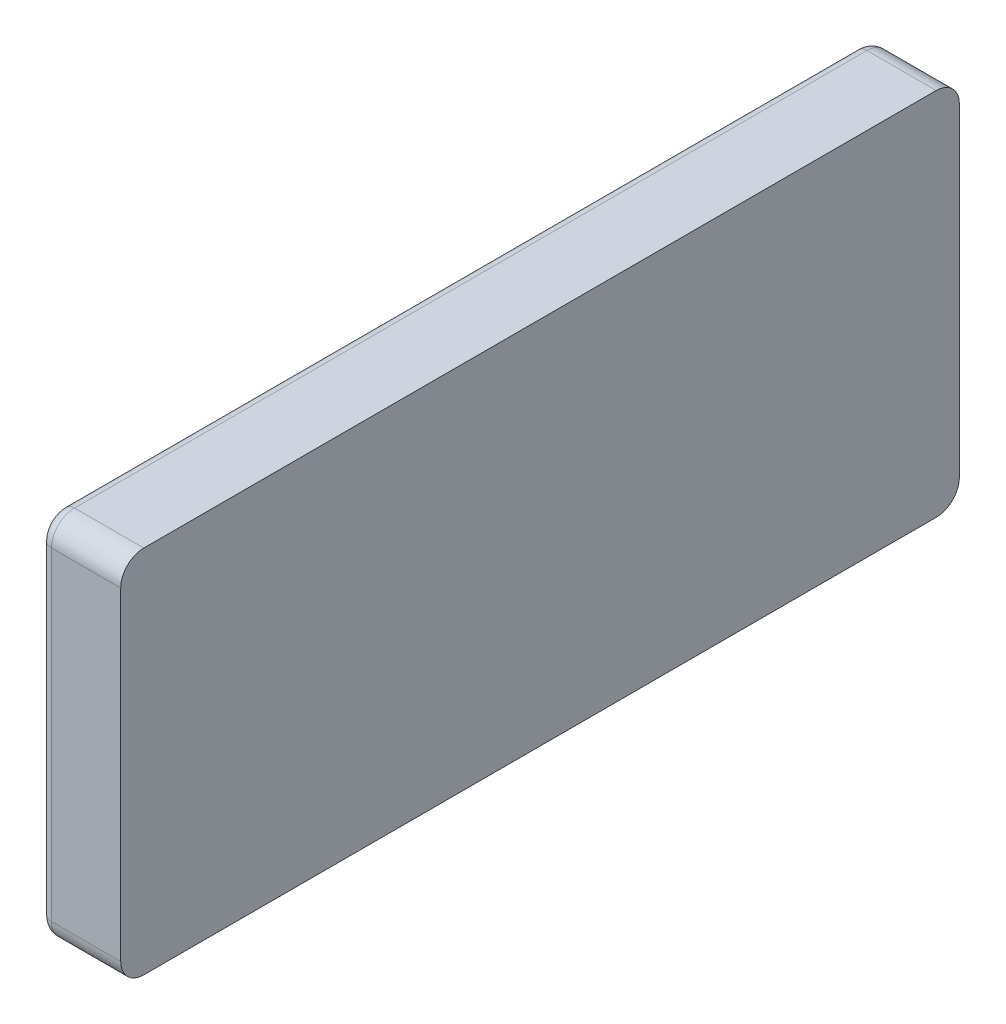
ISO-10303-21;
HEADER;
FILE_DESCRIPTION(('STEP AP214'),'2;1');
FILE_NAME('part.step','',(''),(''),'','','');
FILE_SCHEMA(('AUTOMOTIVE_DESIGN { 1 0 10303 214 1 1 1 1 }'));
ENDSEC;
DATA;
#1=APPLICATION_CONTEXT('core data for automotive mechanical design processes');
#2=APPLICATION_PROTOCOL_DEFINITION('international standard','automotive_design',2000,#1);
#3=PRODUCT_CONTEXT('',#1,'mechanical');
#4=PRODUCT('Part','Part','',(#3));
#5=PRODUCT_RELATED_PRODUCT_CATEGORY('part','',(#4));
#6=PRODUCT_DEFINITION_FORMATION('','',#4);
#7=PRODUCT_DEFINITION_CONTEXT('part definition',#1,'design');
#8=PRODUCT_DEFINITION('design','',#6,#7);
#9=PRODUCT_DEFINITION_SHAPE('','',#8);
#10=(LENGTH_UNIT() NAMED_UNIT(*) SI_UNIT(.MILLI.,.METRE.));
#11=(NAMED_UNIT(*) PLANE_ANGLE_UNIT() SI_UNIT($,.RADIAN.));
#12=(NAMED_UNIT(*) SI_UNIT($,.STERADIAN.) SOLID_ANGLE_UNIT());
#13=UNCERTAINTY_MEASURE_WITH_UNIT(LENGTH_MEASURE(1.E-05),#10,'distance_accuracy_value','');
#14=(GEOMETRIC_REPRESENTATION_CONTEXT(3) GLOBAL_UNCERTAINTY_ASSIGNED_CONTEXT((#13)) GLOBAL_UNIT_ASSIGNED_CONTEXT((#10,
#11,#12)) REPRESENTATION_CONTEXT('',''));
#15=CARTESIAN_POINT('',(0.,0.,0.));
#16=DIRECTION('',(0.,0.,1.));
#17=DIRECTION('',(1.,0.,0.));
#18=AXIS2_PLACEMENT_3D('',#15,#16,#17);
#19=CARTESIAN_POINT('',(-24.0876040847697,19.4723765469581,42.1421599693255));
#20=DIRECTION('',(-1.,0.,0.));
#21=DIRECTION('',(0.,0.707106781186549,-0.707106781186546));
#22=AXIS2_PLACEMENT_3D('',#19,#20,#21);
#23=CYLINDRICAL_SURFACE('',#22,1.);
#24=CARTESIAN_POINT('',(-51.2876040847697,19.472376546958,42.1421599693246));
#25=DIRECTION('',(-1.,0.,0.));
#26=DIRECTION('',(0.,0.707106781186549,-0.707106781186546));
#27=AXIS2_PLACEMENT_3D('',#24,#25,#26);
#28=CIRCLE('',#27,1.);
#29=CARTESIAN_POINT('',(-51.2876040847697,20.4723765469581,42.1421599693246));
#30=VERTEX_POINT('',#29);
#31=CARTESIAN_POINT('',(-51.2876040847697,19.472376546958,41.1421599693246));
#32=VERTEX_POINT('',#31);
#33=EDGE_CURVE('E234',#30,#32,#28,.T.);
#34=ORIENTED_EDGE('',*,*,#33,.T.);
#35=DIRECTION('',(-1.,0.,0.));
#36=VECTOR('',#35,1.);
#37=CARTESIAN_POINT('',(-24.0876040847697,19.4723765469581,41.1421599693255));
#38=LINE('',#37,#36);
#39=CARTESIAN_POINT('',(-54.2876040847697,19.472376546958,41.1421599693245));
#40=VERTEX_POINT('',#39);
#41=EDGE_CURVE('E225',#32,#40,#38,.T.);
#42=ORIENTED_EDGE('',*,*,#41,.T.);
#43=CARTESIAN_POINT('',(-54.2876040847697,19.472376546958,42.1421599693245));
#44=DIRECTION('',(-1.,0.,0.));
#45=DIRECTION('',(0.,0.707106781186549,-0.707106781186546));
#46=AXIS2_PLACEMENT_3D('',#43,#44,#45);
#47=CIRCLE('',#46,1.);
#48=CARTESIAN_POINT('',(-54.2876040847697,20.472376546958,42.1421599693245));
#49=VERTEX_POINT('',#48);
#50=EDGE_CURVE('E272',#49,#40,#47,.T.);
#51=ORIENTED_EDGE('',*,*,#50,.F.);
#52=DIRECTION('',(1.,0.,0.));
#53=VECTOR('',#52,1.);
#54=CARTESIAN_POINT('',(-24.0876040847697,20.4723765469581,42.1421599693255));
#55=LINE('',#54,#53);
#56=EDGE_CURVE('E317',#49,#30,#55,.T.);
#57=ORIENTED_EDGE('',*,*,#56,.T.);
#58=EDGE_LOOP('',(#34,#42,#51,#57));
#59=FACE_BOUND('',#58,.T.);
#60=ADVANCED_FACE('F17',(#59),#23,.T.);
#61=CARTESIAN_POINT('',(-54.7876040847707,17.972376546958,74.9421599693245));
#62=DIRECTION('',(1.,0.,0.));
#63=DIRECTION('',(0.,-1.,0.));
#64=AXIS2_PLACEMENT_3D('',#61,#62,#63);
#65=CYLINDRICAL_SURFACE('',#64,1.5);
#66=CARTESIAN_POINT('',(-54.7876040847707,17.972376546958,74.9421599693245));
#67=DIRECTION('',(1.,0.,0.));
#68=DIRECTION('',(0.,-1.,0.));
#69=AXIS2_PLACEMENT_3D('',#66,#67,#68);
#70=CIRCLE('',#69,1.5);
#71=CARTESIAN_POINT('',(-54.7876040847707,19.472376546958,74.9421599693245));
#72=VERTEX_POINT('',#71);
#73=EDGE_CURVE('E321',#72,#72,#70,.T.);
#74=ORIENTED_EDGE('',*,*,#73,.F.);
#75=DIRECTION('',(1.,0.,0.));
#76=VECTOR('',#75,1.);
#77=CARTESIAN_POINT('',(-54.7876040847707,19.472376546958,74.9421599693245));
#78=LINE('',#77,#76);
#79=CARTESIAN_POINT('',(-52.7876040847707,19.472376546958,74.9421599693246));
#80=VERTEX_POINT('',#79);
#81=EDGE_CURVE('E11',#72,#80,#78,.T.);
#82=ORIENTED_EDGE('',*,*,#81,.T.);
#83=CARTESIAN_POINT('',(-52.7876040847707,17.972376546958,74.9421599693246));
#84=DIRECTION('',(1.,0.,0.));
#85=DIRECTION('',(0.,-1.,0.));
#86=AXIS2_PLACEMENT_3D('',#83,#84,#85);
#87=CIRCLE('',#86,1.5);
#88=EDGE_CURVE('E27',#80,#80,#87,.T.);
#89=ORIENTED_EDGE('',*,*,#88,.T.);
#90=ORIENTED_EDGE('',*,*,#81,.F.);
#91=EDGE_LOOP('',(#74,#82,#89,#90));
#92=FACE_BOUND('',#91,.T.);
#93=ADVANCED_FACE('F540',(#92),#65,.F.);
#94=CARTESIAN_POINT('',(-52.7876040847707,17.972376546958,74.9421599693246));
#95=DIRECTION('',(-1.,0.,0.));
#96=DIRECTION('',(0.,0.,1.));
#97=AXIS2_PLACEMENT_3D('',#94,#95,#96);
#98=PLANE('',#97);
#99=ORIENTED_EDGE('',*,*,#88,.F.);
#100=EDGE_LOOP('',(#99));
#101=FACE_BOUND('',#100,.T.);
#102=ADVANCED_FACE('F544',(#101),#98,.T.);
#103=CARTESIAN_POINT('',(-54.7876040847707,6.97237654695804,74.9421599693245));
#104=DIRECTION('',(1.,0.,0.));
#105=DIRECTION('',(0.,-1.,0.));
#106=AXIS2_PLACEMENT_3D('',#103,#104,#105);
#107=CYLINDRICAL_SURFACE('',#106,1.5);
#108=CARTESIAN_POINT('',(-54.7876040847707,6.97237654695804,74.9421599693245));
#109=DIRECTION('',(1.,0.,0.));
#110=DIRECTION('',(0.,-1.,0.));
#111=AXIS2_PLACEMENT_3D('',#108,#109,#110);
#112=CIRCLE('',#111,1.5);
#113=CARTESIAN_POINT('',(-54.7876040847707,8.47237654695804,74.9421599693245));
#114=VERTEX_POINT('',#113);
#115=EDGE_CURVE('E310',#114,#114,#112,.T.);
#116=ORIENTED_EDGE('',*,*,#115,.F.);
#117=DIRECTION('',(1.,0.,0.));
#118=VECTOR('',#117,1.);
#119=CARTESIAN_POINT('',(-54.7876040847707,8.47237654695804,74.9421599693245));
#120=LINE('',#119,#118);
#121=CARTESIAN_POINT('',(-52.7876040847707,8.47237654695805,74.9421599693246));
#122=VERTEX_POINT('',#121);
#123=EDGE_CURVE('E21',#114,#122,#120,.T.);
#124=ORIENTED_EDGE('',*,*,#123,.T.);
#125=CARTESIAN_POINT('',(-52.7876040847707,6.97237654695805,74.9421599693246));
#126=DIRECTION('',(1.,0.,0.));
#127=DIRECTION('',(0.,-1.,0.));
#128=AXIS2_PLACEMENT_3D('',#125,#126,#127);
#129=CIRCLE('',#128,1.5);
#130=EDGE_CURVE('E322',#122,#122,#129,.T.);
#131=ORIENTED_EDGE('',*,*,#130,.T.);
#132=ORIENTED_EDGE('',*,*,#123,.F.);
#133=EDGE_LOOP('',(#116,#124,#131,#132));
#134=FACE_BOUND('',#133,.T.);
#135=ADVANCED_FACE('F668',(#134),#107,.F.);
#136=CARTESIAN_POINT('',(-52.7876040847707,6.97237654695805,74.9421599693246));
#137=DIRECTION('',(-1.,0.,0.));
#138=DIRECTION('',(0.,0.,1.));
#139=AXIS2_PLACEMENT_3D('',#136,#137,#138);
#140=PLANE('',#139);
#141=ORIENTED_EDGE('',*,*,#130,.F.);
#142=EDGE_LOOP('',(#141));
#143=FACE_BOUND('',#142,.T.);
#144=ADVANCED_FACE('F620',(#143),#140,.T.);
#145=CARTESIAN_POINT('',(-54.7876040847697,17.972376546958,43.6421599693245));
#146=DIRECTION('',(1.,0.,0.));
#147=DIRECTION('',(0.,-1.,0.));
#148=AXIS2_PLACEMENT_3D('',#145,#146,#147);
#149=CYLINDRICAL_SURFACE('',#148,1.5);
#150=CARTESIAN_POINT('',(-54.7876040847698,17.972376546958,43.6421599693245));
#151=DIRECTION('',(1.,0.,0.));
#152=DIRECTION('',(0.,-1.,0.));
#153=AXIS2_PLACEMENT_3D('',#150,#151,#152);
#154=CIRCLE('',#153,1.5);
#155=CARTESIAN_POINT('',(-54.7876040847698,19.472376546958,43.6421599693245));
#156=VERTEX_POINT('',#155);
#157=EDGE_CURVE('E305',#156,#156,#154,.T.);
#158=ORIENTED_EDGE('',*,*,#157,.F.);
#159=DIRECTION('',(1.,0.,0.));
#160=VECTOR('',#159,1.);
#161=CARTESIAN_POINT('',(-54.7876040847697,19.472376546958,43.6421599693245));
#162=LINE('',#161,#160);
#163=CARTESIAN_POINT('',(-52.7876040847698,19.472376546958,43.6421599693246));
#164=VERTEX_POINT('',#163);
#165=EDGE_CURVE('E325',#156,#164,#162,.T.);
#166=ORIENTED_EDGE('',*,*,#165,.T.);
#167=CARTESIAN_POINT('',(-52.7876040847697,17.972376546958,43.6421599693246));
#168=DIRECTION('',(1.,0.,0.));
#169=DIRECTION('',(0.,-1.,0.));
#170=AXIS2_PLACEMENT_3D('',#167,#168,#169);
#171=CIRCLE('',#170,1.5);
#172=EDGE_CURVE('E212',#164,#164,#171,.T.);
#173=ORIENTED_EDGE('',*,*,#172,.T.);
#174=ORIENTED_EDGE('',*,*,#165,.F.);
#175=EDGE_LOOP('',(#158,#166,#173,#174));
#176=FACE_BOUND('',#175,.T.);
#177=ADVANCED_FACE('F366',(#176),#149,.F.);
#178=CARTESIAN_POINT('',(-52.7876040847697,17.972376546958,43.6421599693246));
#179=DIRECTION('',(-1.,0.,0.));
#180=DIRECTION('',(0.,0.,1.));
#181=AXIS2_PLACEMENT_3D('',#178,#179,#180);
#182=PLANE('',#181);
#183=ORIENTED_EDGE('',*,*,#172,.F.);
#184=EDGE_LOOP('',(#183));
#185=FACE_BOUND('',#184,.T.);
#186=ADVANCED_FACE('F619',(#185),#182,.T.);
#187=CARTESIAN_POINT('',(-54.7876040847697,6.97237654695804,43.6421599693245));
#188=DIRECTION('',(1.,0.,0.));
#189=DIRECTION('',(0.,-1.,0.));
#190=AXIS2_PLACEMENT_3D('',#187,#188,#189);
#191=CYLINDRICAL_SURFACE('',#190,1.5);
#192=CARTESIAN_POINT('',(-54.7876040847697,6.97237654695804,43.6421599693245));
#193=DIRECTION('',(1.,0.,0.));
#194=DIRECTION('',(0.,-1.,0.));
#195=AXIS2_PLACEMENT_3D('',#192,#193,#194);
#196=CIRCLE('',#195,1.5);
#197=CARTESIAN_POINT('',(-54.7876040847697,8.47237654695804,43.6421599693245));
#198=VERTEX_POINT('',#197);
#199=EDGE_CURVE('E309',#198,#198,#196,.T.);
#200=ORIENTED_EDGE('',*,*,#199,.F.);
#201=DIRECTION('',(1.,0.,0.));
#202=VECTOR('',#201,1.);
#203=CARTESIAN_POINT('',(-54.7876040847697,8.47237654695804,43.6421599693245));
#204=LINE('',#203,#202);
#205=CARTESIAN_POINT('',(-52.7876040847697,8.47237654695805,43.6421599693246));
#206=VERTEX_POINT('',#205);
#207=EDGE_CURVE('E210',#198,#206,#204,.T.);
#208=ORIENTED_EDGE('',*,*,#207,.T.);
#209=CARTESIAN_POINT('',(-52.7876040847697,6.97237654695805,43.6421599693246));
#210=DIRECTION('',(1.,0.,0.));
#211=DIRECTION('',(0.,-1.,0.));
#212=AXIS2_PLACEMENT_3D('',#209,#210,#211);
#213=CIRCLE('',#212,1.5);
#214=EDGE_CURVE('E213',#206,#206,#213,.T.);
#215=ORIENTED_EDGE('',*,*,#214,.T.);
#216=ORIENTED_EDGE('',*,*,#207,.F.);
#217=EDGE_LOOP('',(#200,#208,#215,#216));
#218=FACE_BOUND('',#217,.T.);
#219=ADVANCED_FACE('F643',(#218),#191,.F.);
#220=CARTESIAN_POINT('',(-52.7876040847697,6.97237654695805,43.6421599693246));
#221=DIRECTION('',(-1.,0.,0.));
#222=DIRECTION('',(0.,0.,1.));
#223=AXIS2_PLACEMENT_3D('',#220,#221,#222);
#224=PLANE('',#223);
#225=ORIENTED_EDGE('',*,*,#214,.F.);
#226=EDGE_LOOP('',(#225));
#227=FACE_BOUND('',#226,.T.);
#228=ADVANCED_FACE('F635',(#227),#224,.T.);
#229=CARTESIAN_POINT('',(-24.0876040847708,20.4723765469581,77.4421599693255));
#230=DIRECTION('',(0.,1.,0.));
#231=DIRECTION('',(1.,0.,0.));
#232=AXIS2_PLACEMENT_3D('',#229,#230,#231);
#233=PLANE('',#232);
#234=DIRECTION('',(0.,0.,-1.));
#235=VECTOR('',#234,1.);
#236=CARTESIAN_POINT('',(-51.2876040847705,20.4723765469581,68.3671599693248));
#237=LINE('',#236,#235);
#238=CARTESIAN_POINT('',(-51.2876040847708,20.4723765469581,76.4421599693246));
#239=VERTEX_POINT('',#238);
#240=EDGE_CURVE('E238',#239,#30,#237,.T.);
#241=ORIENTED_EDGE('',*,*,#240,.T.);
#242=ORIENTED_EDGE('',*,*,#56,.F.);
#243=DIRECTION('',(0.,0.,-1.));
#244=VECTOR('',#243,1.);
#245=CARTESIAN_POINT('',(-54.2876040847705,20.472376546958,68.3671599693245));
#246=LINE('',#245,#244);
#247=CARTESIAN_POINT('',(-54.2876040847708,20.472376546958,76.4421599693245));
#248=VERTEX_POINT('',#247);
#249=EDGE_CURVE('E273',#248,#49,#246,.T.);
#250=ORIENTED_EDGE('',*,*,#249,.F.);
#251=DIRECTION('',(-1.,0.,0.));
#252=VECTOR('',#251,1.);
#253=CARTESIAN_POINT('',(-24.0876040847708,20.4723765469581,76.4421599693255));
#254=LINE('',#253,#252);
#255=EDGE_CURVE('E276',#239,#248,#254,.T.);
#256=ORIENTED_EDGE('',*,*,#255,.F.);
#257=EDGE_LOOP('',(#241,#242,#250,#256));
#258=FACE_BOUND('',#257,.T.);
#259=ADVANCED_FACE('F408',(#258),#233,.T.);
#260=CARTESIAN_POINT('',(-54.2876040847697,19.472376546958,42.1421599693245));
#261=DIRECTION('',(1.,0.,0.));
#262=DIRECTION('',(0.,0.,-1.));
#263=AXIS2_PLACEMENT_3D('',#260,#261,#262);
#264=DEGENERATE_TOROIDAL_SURFACE('',#263,0.5,0.500000000000013,.T.);
#265=CARTESIAN_POINT('',(-54.2876040847697,19.472376546958,41.6421599693245));
#266=DIRECTION('',(0.,1.,0.));
#267=DIRECTION('',(0.,0.,-1.));
#268=AXIS2_PLACEMENT_3D('',#265,#266,#267);
#269=CIRCLE('',#268,0.5);
#270=CARTESIAN_POINT('',(-54.7876040847697,19.472376546958,41.6421599693245));
#271=VERTEX_POINT('',#270);
#272=EDGE_CURVE('E229',#40,#271,#269,.T.);
#273=ORIENTED_EDGE('',*,*,#272,.T.);
#274=CARTESIAN_POINT('',(-54.7876040847697,19.472376546958,42.1421599693245));
#275=DIRECTION('',(1.,0.,0.));
#276=DIRECTION('',(0.,0.707106781186549,-0.707106781186546));
#277=AXIS2_PLACEMENT_3D('',#274,#275,#276);
#278=CIRCLE('',#277,0.5);
#279=CARTESIAN_POINT('',(-54.7876040847697,19.972376546958,42.1421599693245));
#280=VERTEX_POINT('',#279);
#281=EDGE_CURVE('E284',#271,#280,#278,.T.);
#282=ORIENTED_EDGE('',*,*,#281,.T.);
#283=CARTESIAN_POINT('',(-54.2876040847697,19.972376546958,42.1421599693245));
#284=DIRECTION('',(0.,0.,-1.));
#285=DIRECTION('',(-1.,0.,0.));
#286=AXIS2_PLACEMENT_3D('',#283,#284,#285);
#287=CIRCLE('',#286,0.500000000000007);
#288=EDGE_CURVE('E269',#280,#49,#287,.T.);
#289=ORIENTED_EDGE('',*,*,#288,.T.);
#290=ORIENTED_EDGE('',*,*,#50,.T.);
#291=EDGE_LOOP('',(#273,#282,#289,#290));
#292=FACE_BOUND('',#291,.T.);
#293=ADVANCED_FACE('F384',(#292),#264,.T.);
#294=CARTESIAN_POINT('',(-54.2876040847705,19.972376546958,68.3671599693245));
#295=DIRECTION('',(0.,0.,-1.));
#296=DIRECTION('',(-0.707106781186544,0.707106781186551,0.));
#297=AXIS2_PLACEMENT_3D('',#294,#295,#296);
#298=CYLINDRICAL_SURFACE('',#297,0.5);
#299=CARTESIAN_POINT('',(-54.2876040847708,19.972376546958,76.4421599693245));
#300=DIRECTION('',(0.,0.,-1.));
#301=DIRECTION('',(-1.,0.,0.));
#302=AXIS2_PLACEMENT_3D('',#299,#300,#301);
#303=CIRCLE('',#302,0.5);
#304=CARTESIAN_POINT('',(-54.7876040847708,19.972376546958,76.4421599693245));
#305=VERTEX_POINT('',#304);
#306=EDGE_CURVE('E348',#305,#248,#303,.T.);
#307=ORIENTED_EDGE('',*,*,#306,.T.);
#308=ORIENTED_EDGE('',*,*,#249,.T.);
#309=ORIENTED_EDGE('',*,*,#288,.F.);
#310=DIRECTION('',(0.,0.,1.));
#311=VECTOR('',#310,1.);
#312=CARTESIAN_POINT('',(-54.7876040847705,19.972376546958,68.3671599693245));
#313=LINE('',#312,#311);
#314=EDGE_CURVE('E314',#280,#305,#313,.T.);
#315=ORIENTED_EDGE('',*,*,#314,.T.);
#316=EDGE_LOOP('',(#307,#308,#309,#315));
#317=FACE_BOUND('',#316,.T.);
#318=ADVANCED_FACE('F406',(#317),#298,.T.);
#319=CARTESIAN_POINT('',(-54.2876040847708,19.472376546958,76.4421599693245));
#320=DIRECTION('',(1.,0.,0.));
#321=DIRECTION('',(0.,0.,-1.));
#322=AXIS2_PLACEMENT_3D('',#319,#320,#321);
#323=DEGENERATE_TOROIDAL_SURFACE('',#322,0.499999999999966,0.500000000000006,.T.);
#324=CARTESIAN_POINT('',(-54.2876040847708,19.472376546958,76.9421599693245));
#325=DIRECTION('',(0.,1.,0.));
#326=DIRECTION('',(-1.,0.,0.));
#327=AXIS2_PLACEMENT_3D('',#324,#325,#326);
#328=CIRCLE('',#327,0.499999999999989);
#329=CARTESIAN_POINT('',(-54.7876040847708,19.472376546958,76.9421599693245));
#330=VERTEX_POINT('',#329);
#331=CARTESIAN_POINT('',(-54.2876040847708,19.472376546958,77.4421599693245));
#332=VERTEX_POINT('',#331);
#333=EDGE_CURVE('E345',#330,#332,#328,.T.);
#334=ORIENTED_EDGE('',*,*,#333,.T.);
#335=CARTESIAN_POINT('',(-54.2876040847708,19.472376546958,76.4421599693245));
#336=DIRECTION('',(-1.,0.,0.));
#337=DIRECTION('',(0.,0.707106781186551,0.707106781186544));
#338=AXIS2_PLACEMENT_3D('',#335,#336,#337);
#339=CIRCLE('',#338,1.);
#340=EDGE_CURVE('E280',#332,#248,#339,.T.);
#341=ORIENTED_EDGE('',*,*,#340,.T.);
#342=ORIENTED_EDGE('',*,*,#306,.F.);
#343=CARTESIAN_POINT('',(-54.7876040847708,19.472376546958,76.4421599693245));
#344=DIRECTION('',(1.,0.,0.));
#345=DIRECTION('',(0.,0.707106781186551,0.707106781186544));
#346=AXIS2_PLACEMENT_3D('',#343,#344,#345);
#347=CIRCLE('',#346,0.5);
#348=EDGE_CURVE('E302',#305,#330,#347,.T.);
#349=ORIENTED_EDGE('',*,*,#348,.T.);
#350=EDGE_LOOP('',(#334,#341,#342,#349));
#351=FACE_BOUND('',#350,.T.);
#352=ADVANCED_FACE('F403',(#351),#323,.T.);
#353=CARTESIAN_POINT('',(-54.2876040847708,8.47237654695805,76.9421599693245));
#354=DIRECTION('',(0.,1.,0.));
#355=DIRECTION('',(-0.707106781186573,0.,0.707106781186522));
#356=AXIS2_PLACEMENT_3D('',#353,#354,#355);
#357=CYLINDRICAL_SURFACE('',#356,0.5);
#358=CARTESIAN_POINT('',(-54.2876040847708,5.47237654695804,76.9421599693245));
#359=DIRECTION('',(0.,1.,0.));
#360=DIRECTION('',(-1.,0.,0.));
#361=AXIS2_PLACEMENT_3D('',#358,#359,#360);
#362=CIRCLE('',#361,0.5);
#363=CARTESIAN_POINT('',(-54.7876040847708,5.47237654695804,76.9421599693245));
#364=VERTEX_POINT('',#363);
#365=CARTESIAN_POINT('',(-54.2876040847708,5.47237654695804,77.4421599693245));
#366=VERTEX_POINT('',#365);
#367=EDGE_CURVE('E342',#364,#366,#362,.T.);
#368=ORIENTED_EDGE('',*,*,#367,.T.);
#369=DIRECTION('',(0.,1.,0.));
#370=VECTOR('',#369,1.);
#371=CARTESIAN_POINT('',(-54.2876040847708,8.47237654695805,77.4421599693245));
#372=LINE('',#371,#370);
#373=EDGE_CURVE('E176',#366,#332,#372,.T.);
#374=ORIENTED_EDGE('',*,*,#373,.T.);
#375=ORIENTED_EDGE('',*,*,#333,.F.);
#376=DIRECTION('',(0.,-1.,0.));
#377=VECTOR('',#376,1.);
#378=CARTESIAN_POINT('',(-54.7876040847708,8.47237654695804,76.9421599693245));
#379=LINE('',#378,#377);
#380=EDGE_CURVE('E298',#330,#364,#379,.T.);
#381=ORIENTED_EDGE('',*,*,#380,.T.);
#382=EDGE_LOOP('',(#368,#374,#375,#381));
#383=FACE_BOUND('',#382,.T.);
#384=ADVANCED_FACE('F401',(#383),#357,.T.);
#385=CARTESIAN_POINT('',(-54.2876040847707,5.47237654695799,76.4421599693246));
#386=DIRECTION('',(1.,0.,2.22044604925013E-13));
#387=DIRECTION('',(2.22044604925013E-13,0.,-1.));
#388=AXIS2_PLACEMENT_3D('',#385,#386,#387);
#389=DEGENERATE_TOROIDAL_SURFACE('',#388,0.499999999999903,0.499999999999997,.T.);
#390=CARTESIAN_POINT('',(-54.2876040847707,4.97237654695804,76.4421599693245));
#391=DIRECTION('',(0.,0.,1.));
#392=DIRECTION('',(-1.,0.,0.));
#393=AXIS2_PLACEMENT_3D('',#390,#391,#392);
#394=CIRCLE('',#393,0.499999999999989);
#395=CARTESIAN_POINT('',(-54.7876040847707,4.97237654695804,76.4421599693245));
#396=VERTEX_POINT('',#395);
#397=CARTESIAN_POINT('',(-54.2876040847707,4.47237654695804,76.4421599693245));
#398=VERTEX_POINT('',#397);
#399=EDGE_CURVE('E339',#396,#398,#394,.T.);
#400=ORIENTED_EDGE('',*,*,#399,.T.);
#401=CARTESIAN_POINT('',(-54.2876040847707,5.47237654695804,76.4421599693245));
#402=DIRECTION('',(-1.,0.,0.));
#403=DIRECTION('',(0.,-0.70710678118655,0.707106781186545));
#404=AXIS2_PLACEMENT_3D('',#401,#402,#403);
#405=CIRCLE('',#404,1.);
#406=EDGE_CURVE('E181',#398,#366,#405,.T.);
#407=ORIENTED_EDGE('',*,*,#406,.T.);
#408=ORIENTED_EDGE('',*,*,#367,.F.);
#409=CARTESIAN_POINT('',(-54.7876040847707,5.47237654695804,76.4421599693245));
#410=DIRECTION('',(1.,0.,0.));
#411=DIRECTION('',(0.,-0.70710678118655,0.707106781186545));
#412=AXIS2_PLACEMENT_3D('',#409,#410,#411);
#413=CIRCLE('',#412,0.5);
#414=EDGE_CURVE('E294',#364,#396,#413,.T.);
#415=ORIENTED_EDGE('',*,*,#414,.T.);
#416=EDGE_LOOP('',(#400,#407,#408,#415));
#417=FACE_BOUND('',#416,.T.);
#418=ADVANCED_FACE('F399',(#417),#389,.T.);
#419=CARTESIAN_POINT('',(-54.2876040847699,4.97237654695804,50.2171599693245));
#420=DIRECTION('',(0.,0.,1.));
#421=DIRECTION('',(-0.70710678118654,-0.707106781186555,0.));
#422=AXIS2_PLACEMENT_3D('',#419,#420,#421);
#423=CYLINDRICAL_SURFACE('',#422,0.5);
#424=CARTESIAN_POINT('',(-54.2876040847697,4.97237654695804,42.1421599693245));
#425=DIRECTION('',(0.,0.,1.));
#426=DIRECTION('',(-1.,0.,0.));
#427=AXIS2_PLACEMENT_3D('',#424,#425,#426);
#428=CIRCLE('',#427,0.5);
#429=CARTESIAN_POINT('',(-54.7876040847697,4.97237654695804,42.1421599693245));
#430=VERTEX_POINT('',#429);
#431=CARTESIAN_POINT('',(-54.2876040847697,4.47237654695804,42.1421599693245));
#432=VERTEX_POINT('',#431);
#433=EDGE_CURVE('E232',#430,#432,#428,.T.);
#434=ORIENTED_EDGE('',*,*,#433,.T.);
#435=DIRECTION('',(0.,0.,1.));
#436=VECTOR('',#435,1.);
#437=CARTESIAN_POINT('',(-54.2876040847699,4.47237654695804,50.2171599693245));
#438=LINE('',#437,#436);
#439=EDGE_CURVE('E182',#432,#398,#438,.T.);
#440=ORIENTED_EDGE('',*,*,#439,.T.);
#441=ORIENTED_EDGE('',*,*,#399,.F.);
#442=DIRECTION('',(0.,0.,-1.));
#443=VECTOR('',#442,1.);
#444=CARTESIAN_POINT('',(-54.7876040847699,4.97237654695804,50.2171599693245));
#445=LINE('',#444,#443);
#446=EDGE_CURVE('E254',#396,#430,#445,.T.);
#447=ORIENTED_EDGE('',*,*,#446,.T.);
#448=EDGE_LOOP('',(#434,#440,#441,#447));
#449=FACE_BOUND('',#448,.T.);
#450=ADVANCED_FACE('F396',(#449),#423,.T.);
#451=CARTESIAN_POINT('',(-54.2876040847697,5.47237654695805,42.1421599693246));
#452=DIRECTION('',(1.,0.,1.66533453693782E-13));
#453=DIRECTION('',(1.66533453693782E-13,0.,-1.));
#454=AXIS2_PLACEMENT_3D('',#451,#452,#453);
#455=TOROIDAL_SURFACE('',#454,0.500000000000013,0.49999999999999);
#456=CARTESIAN_POINT('',(-54.2876040847696,5.47237654695804,41.6421599693245));
#457=DIRECTION('',(0.,-1.,0.));
#458=DIRECTION('',(-1.,0.,0.));
#459=AXIS2_PLACEMENT_3D('',#456,#457,#458);
#460=CIRCLE('',#459,0.500000000000007);
#461=CARTESIAN_POINT('',(-54.7876040847697,5.47237654695804,41.6421599693245));
#462=VERTEX_POINT('',#461);
#463=CARTESIAN_POINT('',(-54.2876040847696,5.47237654695804,41.1421599693245));
#464=VERTEX_POINT('',#463);
#465=EDGE_CURVE('E233',#462,#464,#460,.T.);
#466=ORIENTED_EDGE('',*,*,#465,.T.);
#467=CARTESIAN_POINT('',(-54.2876040847697,5.47237654695804,42.1421599693245));
#468=DIRECTION('',(-1.,0.,0.));
#469=DIRECTION('',(0.,-0.707106781186548,-0.707106781186547));
#470=AXIS2_PLACEMENT_3D('',#467,#468,#469);
#471=CIRCLE('',#470,1.);
#472=EDGE_CURVE('E220',#464,#432,#471,.T.);
#473=ORIENTED_EDGE('',*,*,#472,.T.);
#474=ORIENTED_EDGE('',*,*,#433,.F.);
#475=CARTESIAN_POINT('',(-54.7876040847697,5.47237654695804,42.1421599693245));
#476=DIRECTION('',(1.,0.,0.));
#477=DIRECTION('',(0.,-0.707106781186548,-0.707106781186547));
#478=AXIS2_PLACEMENT_3D('',#475,#476,#477);
#479=CIRCLE('',#478,0.5);
#480=EDGE_CURVE('E250',#430,#462,#479,.T.);
#481=ORIENTED_EDGE('',*,*,#480,.T.);
#482=EDGE_LOOP('',(#466,#473,#474,#481));
#483=FACE_BOUND('',#482,.T.);
#484=ADVANCED_FACE('F19',(#483),#455,.T.);
#485=CARTESIAN_POINT('',(-54.2876040847697,16.472376546958,41.6421599693245));
#486=DIRECTION('',(0.,-1.,0.));
#487=DIRECTION('',(-0.70710678118651,0.,-0.707106781186585));
#488=AXIS2_PLACEMENT_3D('',#485,#486,#487);
#489=CYLINDRICAL_SURFACE('',#488,0.5);
#490=ORIENTED_EDGE('',*,*,#465,.F.);
#491=DIRECTION('',(0.,1.,0.));
#492=VECTOR('',#491,1.);
#493=CARTESIAN_POINT('',(-54.7876040847697,16.472376546958,41.6421599693245));
#494=LINE('',#493,#492);
#495=EDGE_CURVE('E255',#462,#271,#494,.T.);
#496=ORIENTED_EDGE('',*,*,#495,.T.);
#497=ORIENTED_EDGE('',*,*,#272,.F.);
#498=DIRECTION('',(0.,-1.,0.));
#499=VECTOR('',#498,1.);
#500=CARTESIAN_POINT('',(-54.2876040847697,16.472376546958,41.1421599693245));
#501=LINE('',#500,#499);
#502=EDGE_CURVE('E221',#40,#464,#501,.T.);
#503=ORIENTED_EDGE('',*,*,#502,.T.);
#504=EDGE_LOOP('',(#490,#496,#497,#503));
#505=FACE_BOUND('',#504,.T.);
#506=ADVANCED_FACE('F373',(#505),#489,.T.);
#507=CARTESIAN_POINT('',(-54.7876040847702,12.472376546958,59.2921599693245));
#508=DIRECTION('',(-1.,0.,0.));
#509=DIRECTION('',(0.,0.,1.));
#510=AXIS2_PLACEMENT_3D('',#507,#508,#509);
#511=PLANE('',#510);
#512=ORIENTED_EDGE('',*,*,#199,.T.);
#513=EDGE_LOOP('',(#512));
#514=FACE_BOUND('',#513,.T.);
#515=ORIENTED_EDGE('',*,*,#157,.T.);
#516=EDGE_LOOP('',(#515));
#517=FACE_BOUND('',#516,.T.);
#518=ORIENTED_EDGE('',*,*,#115,.T.);
#519=EDGE_LOOP('',(#518));
#520=FACE_BOUND('',#519,.T.);
#521=ORIENTED_EDGE('',*,*,#73,.T.);
#522=EDGE_LOOP('',(#521));
#523=FACE_BOUND('',#522,.T.);
#524=ORIENTED_EDGE('',*,*,#281,.F.);
#525=ORIENTED_EDGE('',*,*,#495,.F.);
#526=ORIENTED_EDGE('',*,*,#480,.F.);
#527=ORIENTED_EDGE('',*,*,#446,.F.);
#528=ORIENTED_EDGE('',*,*,#414,.F.);
#529=ORIENTED_EDGE('',*,*,#380,.F.);
#530=ORIENTED_EDGE('',*,*,#348,.F.);
#531=ORIENTED_EDGE('',*,*,#314,.F.);
#532=EDGE_LOOP('',(#524,#525,#526,#527,#528,#529,#530,#531));
#533=FACE_BOUND('',#532,.T.);
#534=ADVANCED_FACE('F369',(#514,#517,#520,#523,#533),#511,.T.);
#535=CARTESIAN_POINT('',(-24.0876040847708,19.4723765469581,76.4421599693255));
#536=DIRECTION('',(-1.,0.,0.));
#537=DIRECTION('',(0.,0.707106781186549,0.707106781186546));
#538=AXIS2_PLACEMENT_3D('',#535,#536,#537);
#539=CYLINDRICAL_SURFACE('',#538,1.);
#540=CARTESIAN_POINT('',(-51.2876040847708,19.472376546958,76.4421599693246));
#541=DIRECTION('',(-1.,0.,0.));
#542=DIRECTION('',(0.,0.707106781186549,0.707106781186546));
#543=AXIS2_PLACEMENT_3D('',#540,#541,#542);
#544=CIRCLE('',#543,1.);
#545=CARTESIAN_POINT('',(-51.2876040847708,19.472376546958,77.4421599693246));
#546=VERTEX_POINT('',#545);
#547=EDGE_CURVE('E199',#546,#239,#544,.T.);
#548=ORIENTED_EDGE('',*,*,#547,.T.);
#549=ORIENTED_EDGE('',*,*,#255,.T.);
#550=ORIENTED_EDGE('',*,*,#340,.F.);
#551=DIRECTION('',(1.,0.,0.));
#552=VECTOR('',#551,1.);
#553=CARTESIAN_POINT('',(-24.0876040847708,19.4723765469581,77.4421599693255));
#554=LINE('',#553,#552);
#555=EDGE_CURVE('E215',#332,#546,#554,.T.);
#556=ORIENTED_EDGE('',*,*,#555,.T.);
#557=EDGE_LOOP('',(#548,#549,#550,#556));
#558=FACE_BOUND('',#557,.T.);
#559=ADVANCED_FACE('F372',(#558),#539,.T.);
#560=CARTESIAN_POINT('',(-24.0876040847708,4.47237654695811,77.4421599693255));
#561=DIRECTION('',(0.,0.,1.));
#562=DIRECTION('',(1.,0.,0.));
#563=AXIS2_PLACEMENT_3D('',#560,#561,#562);
#564=PLANE('',#563);
#565=DIRECTION('',(0.,1.,0.));
#566=VECTOR('',#565,1.);
#567=CARTESIAN_POINT('',(-51.2876040847708,8.47237654695805,77.4421599693246));
#568=LINE('',#567,#566);
#569=CARTESIAN_POINT('',(-51.2876040847708,5.47237654695805,77.4421599693246));
#570=VERTEX_POINT('',#569);
#571=EDGE_CURVE('E174',#570,#546,#568,.T.);
#572=ORIENTED_EDGE('',*,*,#571,.T.);
#573=ORIENTED_EDGE('',*,*,#555,.F.);
#574=ORIENTED_EDGE('',*,*,#373,.F.);
#575=DIRECTION('',(-1.,0.,0.));
#576=VECTOR('',#575,1.);
#577=CARTESIAN_POINT('',(-24.0876040847708,5.47237654695811,77.4421599693255));
#578=LINE('',#577,#576);
#579=EDGE_CURVE('E169',#570,#366,#578,.T.);
#580=ORIENTED_EDGE('',*,*,#579,.F.);
#581=EDGE_LOOP('',(#572,#573,#574,#580));
#582=FACE_BOUND('',#581,.T.);
#583=ADVANCED_FACE('F171',(#582),#564,.T.);
#584=CARTESIAN_POINT('',(-24.0876040847707,5.47237654695811,76.4421599693255));
#585=DIRECTION('',(-1.,0.,0.));
#586=DIRECTION('',(0.,-0.707106781186549,0.707106781186546));
#587=AXIS2_PLACEMENT_3D('',#584,#585,#586);
#588=CYLINDRICAL_SURFACE('',#587,1.);
#589=CARTESIAN_POINT('',(-51.2876040847707,5.47237654695805,76.4421599693246));
#590=DIRECTION('',(-1.,0.,0.));
#591=DIRECTION('',(0.,-0.707106781186549,0.707106781186546));
#592=AXIS2_PLACEMENT_3D('',#589,#590,#591);
#593=CIRCLE('',#592,1.);
#594=CARTESIAN_POINT('',(-51.2876040847707,4.47237654695805,76.4421599693246));
#595=VERTEX_POINT('',#594);
#596=EDGE_CURVE('E185',#595,#570,#593,.T.);
#597=ORIENTED_EDGE('',*,*,#596,.T.);
#598=ORIENTED_EDGE('',*,*,#579,.T.);
#599=ORIENTED_EDGE('',*,*,#406,.F.);
#600=DIRECTION('',(1.,0.,0.));
#601=VECTOR('',#600,1.);
#602=CARTESIAN_POINT('',(-24.0876040847707,4.47237654695811,76.4421599693255));
#603=LINE('',#602,#601);
#604=EDGE_CURVE('E188',#398,#595,#603,.T.);
#605=ORIENTED_EDGE('',*,*,#604,.T.);
#606=EDGE_LOOP('',(#597,#598,#599,#605));
#607=FACE_BOUND('',#606,.T.);
#608=ADVANCED_FACE('F186',(#607),#588,.T.);
#609=CARTESIAN_POINT('',(-24.0876040847696,4.47237654695811,41.1421599693255));
#610=DIRECTION('',(0.,-1.,0.));
#611=DIRECTION('',(0.,0.,-1.));
#612=AXIS2_PLACEMENT_3D('',#609,#610,#611);
#613=PLANE('',#612);
#614=DIRECTION('',(0.,0.,1.));
#615=VECTOR('',#614,1.);
#616=CARTESIAN_POINT('',(-51.2876040847699,4.47237654695805,50.2171599693248));
#617=LINE('',#616,#615);
#618=CARTESIAN_POINT('',(-51.2876040847697,4.47237654695805,42.1421599693246));
#619=VERTEX_POINT('',#618);
#620=EDGE_CURVE('E193',#619,#595,#617,.T.);
#621=ORIENTED_EDGE('',*,*,#620,.T.);
#622=ORIENTED_EDGE('',*,*,#604,.F.);
#623=ORIENTED_EDGE('',*,*,#439,.F.);
#624=DIRECTION('',(-1.,0.,0.));
#625=VECTOR('',#624,1.);
#626=CARTESIAN_POINT('',(-24.0876040847697,4.47237654695811,42.1421599693255));
#627=LINE('',#626,#625);
#628=EDGE_CURVE('E259',#619,#432,#627,.T.);
#629=ORIENTED_EDGE('',*,*,#628,.F.);
#630=EDGE_LOOP('',(#621,#622,#623,#629));
#631=FACE_BOUND('',#630,.T.);
#632=ADVANCED_FACE('F419',(#631),#613,.T.);
#633=CARTESIAN_POINT('',(-24.0876040847697,5.47237654695811,42.1421599693255));
#634=DIRECTION('',(-1.,0.,0.));
#635=DIRECTION('',(0.,-0.707106781186549,-0.707106781186546));
#636=AXIS2_PLACEMENT_3D('',#633,#634,#635);
#637=CYLINDRICAL_SURFACE('',#636,1.);
#638=CARTESIAN_POINT('',(-51.2876040847697,5.47237654695805,42.1421599693246));
#639=DIRECTION('',(-1.,0.,0.));
#640=DIRECTION('',(0.,-0.707106781186549,-0.707106781186546));
#641=AXIS2_PLACEMENT_3D('',#638,#639,#640);
#642=CIRCLE('',#641,1.);
#643=CARTESIAN_POINT('',(-51.2876040847696,5.47237654695805,41.1421599693246));
#644=VERTEX_POINT('',#643);
#645=EDGE_CURVE('E208',#644,#619,#642,.T.);
#646=ORIENTED_EDGE('',*,*,#645,.T.);
#647=ORIENTED_EDGE('',*,*,#628,.T.);
#648=ORIENTED_EDGE('',*,*,#472,.F.);
#649=DIRECTION('',(1.,0.,0.));
#650=VECTOR('',#649,1.);
#651=CARTESIAN_POINT('',(-24.0876040847696,5.47237654695811,41.1421599693255));
#652=LINE('',#651,#650);
#653=EDGE_CURVE('E226',#464,#644,#652,.T.);
#654=ORIENTED_EDGE('',*,*,#653,.T.);
#655=EDGE_LOOP('',(#646,#647,#648,#654));
#656=FACE_BOUND('',#655,.T.);
#657=ADVANCED_FACE('F417',(#656),#637,.T.);
#658=CARTESIAN_POINT('',(-24.0876040847697,20.4723765469581,41.1421599693255));
#659=DIRECTION('',(0.,0.,-1.));
#660=DIRECTION('',(0.,-1.,0.));
#661=AXIS2_PLACEMENT_3D('',#658,#659,#660);
#662=PLANE('',#661);
#663=DIRECTION('',(0.,-1.,0.));
#664=VECTOR('',#663,1.);
#665=CARTESIAN_POINT('',(-51.2876040847697,16.472376546958,41.1421599693246));
#666=LINE('',#665,#664);
#667=EDGE_CURVE('E239',#32,#644,#666,.T.);
#668=ORIENTED_EDGE('',*,*,#667,.T.);
#669=ORIENTED_EDGE('',*,*,#653,.F.);
#670=ORIENTED_EDGE('',*,*,#502,.F.);
#671=ORIENTED_EDGE('',*,*,#41,.F.);
#672=EDGE_LOOP('',(#668,#669,#670,#671));
#673=FACE_BOUND('',#672,.T.);
#674=ADVANCED_FACE('F413',(#673),#662,.T.);
#675=CARTESIAN_POINT('',(-51.2876040847702,12.472376546958,59.292159969325));
#676=DIRECTION('',(-1.,0.,0.));
#677=DIRECTION('',(0.,0.,1.));
#678=AXIS2_PLACEMENT_3D('',#675,#676,#677);
#679=PLANE('',#678);
#680=ORIENTED_EDGE('',*,*,#571,.F.);
#681=ORIENTED_EDGE('',*,*,#596,.F.);
#682=ORIENTED_EDGE('',*,*,#620,.F.);
#683=ORIENTED_EDGE('',*,*,#645,.F.);
#684=ORIENTED_EDGE('',*,*,#667,.F.);
#685=ORIENTED_EDGE('',*,*,#33,.F.);
#686=ORIENTED_EDGE('',*,*,#240,.F.);
#687=ORIENTED_EDGE('',*,*,#547,.F.);
#688=EDGE_LOOP('',(#680,#681,#682,#683,#684,#685,#686,#687));
#689=FACE_BOUND('',#688,.T.);
#690=ADVANCED_FACE('F196',(#689),#679,.F.);
#691=CLOSED_SHELL('',(#60,#93,#102,#135,#144,#177,#186,#219,#228,#259,#293,#318,#352,#384,#418,
#450,#484,#506,#534,#559,#583,#608,#632,#657,#674,#690));
#692=MANIFOLD_SOLID_BREP('B1',#691);
#693=ADVANCED_BREP_SHAPE_REPRESENTATION('',(#18,#692),#14);
#694=SHAPE_DEFINITION_REPRESENTATION(#9,#693);
ENDSEC;
END-ISO-10303-21;
